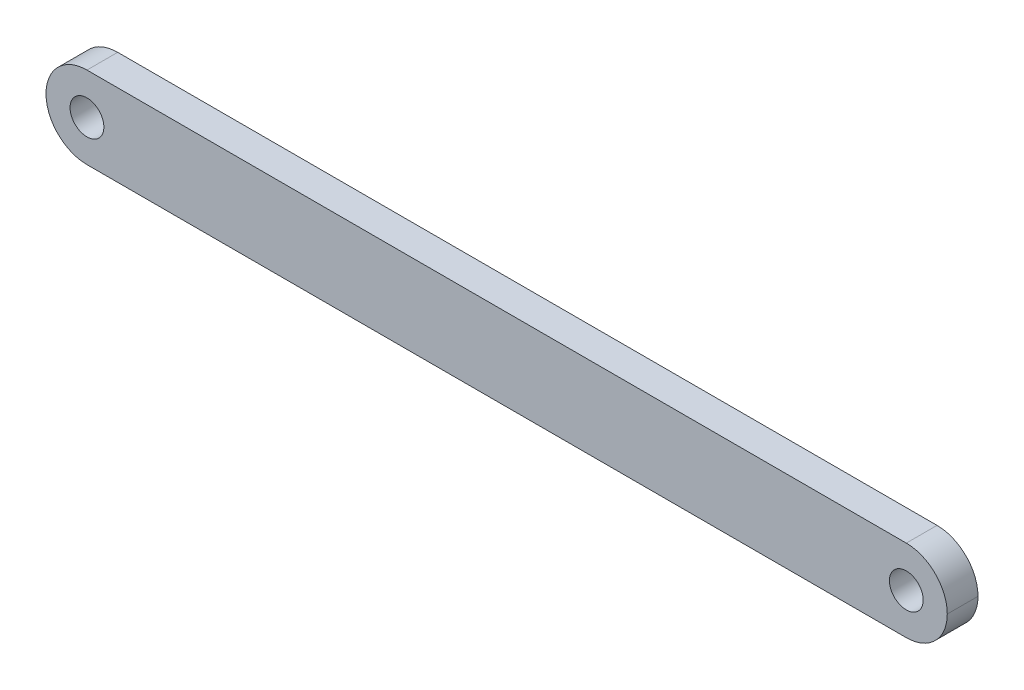
ISO-10303-21;
HEADER;
FILE_DESCRIPTION(('STEP AP214'),'2;1');
FILE_NAME('part.step','',(''),(''),'','','');
FILE_SCHEMA(('AUTOMOTIVE_DESIGN { 1 0 10303 214 1 1 1 1 }'));
ENDSEC;
DATA;
#1=APPLICATION_CONTEXT('core data for automotive mechanical design processes');
#2=APPLICATION_PROTOCOL_DEFINITION('international standard','automotive_design',2000,#1);
#3=PRODUCT_CONTEXT('',#1,'mechanical');
#4=PRODUCT('Part','Part','',(#3));
#5=PRODUCT_RELATED_PRODUCT_CATEGORY('part','',(#4));
#6=PRODUCT_DEFINITION_FORMATION('','',#4);
#7=PRODUCT_DEFINITION_CONTEXT('part definition',#1,'design');
#8=PRODUCT_DEFINITION('design','',#6,#7);
#9=PRODUCT_DEFINITION_SHAPE('','',#8);
#10=(LENGTH_UNIT() NAMED_UNIT(*) SI_UNIT(.MILLI.,.METRE.));
#11=(NAMED_UNIT(*) PLANE_ANGLE_UNIT() SI_UNIT($,.RADIAN.));
#12=(NAMED_UNIT(*) SI_UNIT($,.STERADIAN.) SOLID_ANGLE_UNIT());
#13=UNCERTAINTY_MEASURE_WITH_UNIT(LENGTH_MEASURE(1.E-05),#10,'distance_accuracy_value','');
#14=(GEOMETRIC_REPRESENTATION_CONTEXT(3) GLOBAL_UNCERTAINTY_ASSIGNED_CONTEXT((#13)) GLOBAL_UNIT_ASSIGNED_CONTEXT((#10,
#11,#12)) REPRESENTATION_CONTEXT('',''));
#15=CARTESIAN_POINT('',(0.,0.,0.));
#16=DIRECTION('',(0.,0.,1.));
#17=DIRECTION('',(1.,0.,0.));
#18=AXIS2_PLACEMENT_3D('',#15,#16,#17);
#19=CARTESIAN_POINT('',(55.8602220991314,3.999,0.));
#20=DIRECTION('',(0.,0.,-1.));
#21=DIRECTION('',(-1.,0.,0.));
#22=AXIS2_PLACEMENT_3D('',#19,#20,#21);
#23=PLANE('',#22);
#24=CARTESIAN_POINT('',(55.8597335084298,3.99951153429841,0.));
#25=DIRECTION('',(0.,0.,-1.));
#26=DIRECTION('',(1.,0.,0.));
#27=AXIS2_PLACEMENT_3D('',#24,#25,#26);
#28=CIRCLE('',#27,1.65);
#29=CARTESIAN_POINT('',(54.2097335084298,3.99951153429841,0.));
#30=VERTEX_POINT('',#29);
#31=EDGE_CURVE('E276',#30,#30,#28,.T.);
#32=ORIENTED_EDGE('',*,*,#31,.F.);
#33=EDGE_LOOP('',(#32));
#34=FACE_BOUND('',#33,.T.);
#35=CARTESIAN_POINT('',(-24.138809000818,3.99851153429842,0.));
#36=DIRECTION('',(0.,0.,-1.));
#37=DIRECTION('',(1.,0.,0.));
#38=AXIS2_PLACEMENT_3D('',#35,#36,#37);
#39=CIRCLE('',#38,1.65);
#40=CARTESIAN_POINT('',(-25.788809000818,3.99851153429842,0.));
#41=VERTEX_POINT('',#40);
#42=EDGE_CURVE('E280',#41,#41,#39,.T.);
#43=ORIENTED_EDGE('',*,*,#42,.F.);
#44=EDGE_LOOP('',(#43));
#45=FACE_BOUND('',#44,.T.);
#46=CARTESIAN_POINT('',(55.8602220991314,3.999,0.));
#47=DIRECTION('',(0.,0.,-1.));
#48=DIRECTION('',(-1.,0.,0.));
#49=AXIS2_PLACEMENT_3D('',#46,#47,#48);
#50=CIRCLE('',#49,4.);
#51=CARTESIAN_POINT('',(55.8602220991314,7.999,0.));
#52=VERTEX_POINT('',#51);
#53=CARTESIAN_POINT('',(59.8602219741314,3.99999999998902,0.));
#54=VERTEX_POINT('',#53);
#55=EDGE_CURVE('E138',#52,#54,#50,.T.);
#56=ORIENTED_EDGE('',*,*,#55,.T.);
#57=CARTESIAN_POINT('',(55.8602219741314,4.,0.));
#58=DIRECTION('',(0.,0.,-1.));
#59=DIRECTION('',(-1.,0.,0.));
#60=AXIS2_PLACEMENT_3D('',#57,#58,#59);
#61=CIRCLE('',#60,4.);
#62=CARTESIAN_POINT('',(55.8602219741314,0.,0.));
#63=VERTEX_POINT('',#62);
#64=EDGE_CURVE('E141',#54,#63,#61,.T.);
#65=ORIENTED_EDGE('',*,*,#64,.T.);
#66=DIRECTION('',(-1.,0.,0.));
#67=VECTOR('',#66,1.);
#68=CARTESIAN_POINT('',(55.8602219741314,0.,0.));
#69=LINE('',#68,#67);
#70=CARTESIAN_POINT('',(-24.1383206601164,0.,0.));
#71=VERTEX_POINT('',#70);
#72=EDGE_CURVE('E145',#63,#71,#69,.T.);
#73=ORIENTED_EDGE('',*,*,#72,.T.);
#74=CARTESIAN_POINT('',(-24.1383206601164,4.,0.));
#75=DIRECTION('',(0.,0.,-1.));
#76=DIRECTION('',(-1.,0.,0.));
#77=AXIS2_PLACEMENT_3D('',#74,#75,#76);
#78=CIRCLE('',#77,4.);
#79=CARTESIAN_POINT('',(-28.1383205351164,3.99900000000404,0.));
#80=VERTEX_POINT('',#79);
#81=EDGE_CURVE('E148',#71,#80,#78,.T.);
#82=ORIENTED_EDGE('',*,*,#81,.T.);
#83=CARTESIAN_POINT('',(-24.1383205351164,3.999,0.));
#84=DIRECTION('',(0.,0.,-1.));
#85=DIRECTION('',(-1.,0.,0.));
#86=AXIS2_PLACEMENT_3D('',#83,#84,#85);
#87=CIRCLE('',#86,4.);
#88=CARTESIAN_POINT('',(-24.1383205351164,7.999,0.));
#89=VERTEX_POINT('',#88);
#90=EDGE_CURVE('E115',#80,#89,#87,.T.);
#91=ORIENTED_EDGE('',*,*,#90,.T.);
#92=DIRECTION('',(1.,0.,0.));
#93=VECTOR('',#92,1.);
#94=CARTESIAN_POINT('',(-24.1383205351164,7.999,0.));
#95=LINE('',#94,#93);
#96=EDGE_CURVE('E151',#89,#52,#95,.T.);
#97=ORIENTED_EDGE('',*,*,#96,.T.);
#98=EDGE_LOOP('',(#56,#65,#73,#82,#91,#97));
#99=FACE_BOUND('',#98,.T.);
#100=DIRECTION('',(1.,0.,0.));
#101=VECTOR('',#100,1.);
#102=CARTESIAN_POINT('',(14.0528950600735,4.88743671366821,0.));
#103=LINE('',#102,#101);
#104=CARTESIAN_POINT('',(14.0528950600735,4.88743671366821,0.));
#105=VERTEX_POINT('',#104);
#106=CARTESIAN_POINT('',(15.6752908934068,4.88743671366821,0.));
#107=VERTEX_POINT('',#106);
#108=EDGE_CURVE('E231',#105,#107,#103,.T.);
#109=ORIENTED_EDGE('',*,*,#108,.T.);
#110=DIRECTION('',(0.,1.,0.));
#111=VECTOR('',#110,1.);
#112=CARTESIAN_POINT('',(15.6752908934068,4.88743671366821,0.));
#113=LINE('',#112,#111);
#114=CARTESIAN_POINT('',(15.6752908934068,5.24641107264257,0.));
#115=VERTEX_POINT('',#114);
#116=EDGE_CURVE('E56',#107,#115,#113,.T.);
#117=ORIENTED_EDGE('',*,*,#116,.T.);
#118=DIRECTION('',(-1.,0.,0.));
#119=VECTOR('',#118,1.);
#120=CARTESIAN_POINT('',(15.6752908934068,5.24641107264257,0.));
#121=LINE('',#120,#119);
#122=CARTESIAN_POINT('',(13.5214447395606,5.24641107264257,0.));
#123=VERTEX_POINT('',#122);
#124=EDGE_CURVE('E250',#115,#123,#121,.T.);
#125=ORIENTED_EDGE('',*,*,#124,.T.);
#126=DIRECTION('',(0.456090790910399,-0.889933250556876,0.));
#127=VECTOR('',#126,1.);
#128=CARTESIAN_POINT('',(13.5214447395606,5.24641107264257,0.));
#129=LINE('',#128,#127);
#130=CARTESIAN_POINT('',(15.3611883293042,1.65666748289898,0.));
#131=VERTEX_POINT('',#130);
#132=EDGE_CURVE('E253',#123,#131,#129,.T.);
#133=ORIENTED_EDGE('',*,*,#132,.T.);
#134=DIRECTION('',(0.87607248437468,0.482179429384514,0.));
#135=VECTOR('',#134,1.);
#136=CARTESIAN_POINT('',(15.3611883293042,1.65666748289898,0.));
#137=LINE('',#136,#135);
#138=CARTESIAN_POINT('',(15.6325224639196,1.80600642520667,0.));
#139=VERTEX_POINT('',#138);
#140=EDGE_CURVE('E256',#131,#139,#137,.T.);
#141=ORIENTED_EDGE('',*,*,#140,.T.);
#142=DIRECTION('',(-0.456180989989924,0.889887017756643,0.));
#143=VECTOR('',#142,1.);
#144=CARTESIAN_POINT('',(15.6325224639196,1.80600642520667,0.));
#145=LINE('',#144,#143);
#146=EDGE_CURVE('E236',#139,#105,#145,.T.);
#147=ORIENTED_EDGE('',*,*,#146,.T.);
#148=EDGE_LOOP('',(#109,#117,#125,#133,#141,#147));
#149=FACE_BOUND('',#148,.T.);
#150=ADVANCED_FACE('F39',(#34,#45,#99,#149),#23,.T.);
#151=CARTESIAN_POINT('',(55.8602220991314,3.999,3.));
#152=DIRECTION('',(0.,0.,-1.));
#153=DIRECTION('',(-1.,0.,0.));
#154=AXIS2_PLACEMENT_3D('',#151,#152,#153);
#155=CYLINDRICAL_SURFACE('',#154,4.);
#156=ORIENTED_EDGE('',*,*,#55,.F.);
#157=DIRECTION('',(0.,0.,-1.));
#158=VECTOR('',#157,1.);
#159=CARTESIAN_POINT('',(55.8602220991314,7.999,3.));
#160=LINE('',#159,#158);
#161=CARTESIAN_POINT('',(55.8602220991314,7.999,3.));
#162=VERTEX_POINT('',#161);
#163=EDGE_CURVE('E11',#162,#52,#160,.T.);
#164=ORIENTED_EDGE('',*,*,#163,.F.);
#165=CARTESIAN_POINT('',(55.8602220991314,3.999,3.));
#166=DIRECTION('',(0.,0.,-1.));
#167=DIRECTION('',(-1.,0.,0.));
#168=AXIS2_PLACEMENT_3D('',#165,#166,#167);
#169=CIRCLE('',#168,4.);
#170=CARTESIAN_POINT('',(59.8602219741314,3.99999999998902,3.));
#171=VERTEX_POINT('',#170);
#172=EDGE_CURVE('E153',#162,#171,#169,.T.);
#173=ORIENTED_EDGE('',*,*,#172,.T.);
#174=DIRECTION('',(0.,0.,-1.));
#175=VECTOR('',#174,1.);
#176=CARTESIAN_POINT('',(59.8602219741314,3.99999999998902,3.));
#177=LINE('',#176,#175);
#178=EDGE_CURVE('E43',#171,#54,#177,.T.);
#179=ORIENTED_EDGE('',*,*,#178,.T.);
#180=EDGE_LOOP('',(#156,#164,#173,#179));
#181=FACE_BOUND('',#180,.T.);
#182=ADVANCED_FACE('F41',(#181),#155,.T.);
#183=CARTESIAN_POINT('',(-24.1383205351164,7.999,3.));
#184=DIRECTION('',(0.,1.,0.));
#185=DIRECTION('',(0.,0.,1.));
#186=AXIS2_PLACEMENT_3D('',#183,#184,#185);
#187=PLANE('',#186);
#188=ORIENTED_EDGE('',*,*,#96,.F.);
#189=DIRECTION('',(0.,0.,-1.));
#190=VECTOR('',#189,1.);
#191=CARTESIAN_POINT('',(-24.1383205351164,7.999,3.));
#192=LINE('',#191,#190);
#193=CARTESIAN_POINT('',(-24.1383205351164,7.999,3.));
#194=VERTEX_POINT('',#193);
#195=EDGE_CURVE('E48',#194,#89,#192,.T.);
#196=ORIENTED_EDGE('',*,*,#195,.F.);
#197=DIRECTION('',(1.,0.,0.));
#198=VECTOR('',#197,1.);
#199=CARTESIAN_POINT('',(-24.1383205351164,7.999,3.));
#200=LINE('',#199,#198);
#201=EDGE_CURVE('E128',#194,#162,#200,.T.);
#202=ORIENTED_EDGE('',*,*,#201,.T.);
#203=ORIENTED_EDGE('',*,*,#163,.T.);
#204=EDGE_LOOP('',(#188,#196,#202,#203));
#205=FACE_BOUND('',#204,.T.);
#206=ADVANCED_FACE('F161',(#205),#187,.T.);
#207=CARTESIAN_POINT('',(-24.1383205351164,3.999,3.));
#208=DIRECTION('',(0.,0.,-1.));
#209=DIRECTION('',(-1.,0.,0.));
#210=AXIS2_PLACEMENT_3D('',#207,#208,#209);
#211=CYLINDRICAL_SURFACE('',#210,4.);
#212=ORIENTED_EDGE('',*,*,#90,.F.);
#213=DIRECTION('',(0.,0.,-1.));
#214=VECTOR('',#213,1.);
#215=CARTESIAN_POINT('',(-28.1383205351164,3.99900000000404,3.));
#216=LINE('',#215,#214);
#217=CARTESIAN_POINT('',(-28.1383205351164,3.99900000000404,3.));
#218=VERTEX_POINT('',#217);
#219=EDGE_CURVE('E109',#218,#80,#216,.T.);
#220=ORIENTED_EDGE('',*,*,#219,.F.);
#221=CARTESIAN_POINT('',(-24.1383205351164,3.999,3.));
#222=DIRECTION('',(0.,0.,-1.));
#223=DIRECTION('',(-1.,0.,0.));
#224=AXIS2_PLACEMENT_3D('',#221,#222,#223);
#225=CIRCLE('',#224,4.);
#226=EDGE_CURVE('E112',#218,#194,#225,.T.);
#227=ORIENTED_EDGE('',*,*,#226,.T.);
#228=ORIENTED_EDGE('',*,*,#195,.T.);
#229=EDGE_LOOP('',(#212,#220,#227,#228));
#230=FACE_BOUND('',#229,.T.);
#231=ADVANCED_FACE('F111',(#230),#211,.T.);
#232=CARTESIAN_POINT('',(-24.1383206601164,4.,3.));
#233=DIRECTION('',(0.,0.,-1.));
#234=DIRECTION('',(-1.,0.,0.));
#235=AXIS2_PLACEMENT_3D('',#232,#233,#234);
#236=CYLINDRICAL_SURFACE('',#235,4.);
#237=ORIENTED_EDGE('',*,*,#81,.F.);
#238=DIRECTION('',(0.,0.,-1.));
#239=VECTOR('',#238,1.);
#240=CARTESIAN_POINT('',(-24.1383206601164,0.,3.));
#241=LINE('',#240,#239);
#242=CARTESIAN_POINT('',(-24.1383206601164,0.,3.));
#243=VERTEX_POINT('',#242);
#244=EDGE_CURVE('E120',#243,#71,#241,.T.);
#245=ORIENTED_EDGE('',*,*,#244,.F.);
#246=CARTESIAN_POINT('',(-24.1383206601164,4.,3.));
#247=DIRECTION('',(0.,0.,-1.));
#248=DIRECTION('',(-1.,0.,0.));
#249=AXIS2_PLACEMENT_3D('',#246,#247,#248);
#250=CIRCLE('',#249,4.);
#251=EDGE_CURVE('E126',#243,#218,#250,.T.);
#252=ORIENTED_EDGE('',*,*,#251,.T.);
#253=ORIENTED_EDGE('',*,*,#219,.T.);
#254=EDGE_LOOP('',(#237,#245,#252,#253));
#255=FACE_BOUND('',#254,.T.);
#256=ADVANCED_FACE('F130',(#255),#236,.T.);
#257=CARTESIAN_POINT('',(55.8602219741314,0.,3.));
#258=DIRECTION('',(0.,-1.,0.));
#259=DIRECTION('',(0.,0.,-1.));
#260=AXIS2_PLACEMENT_3D('',#257,#258,#259);
#261=PLANE('',#260);
#262=ORIENTED_EDGE('',*,*,#72,.F.);
#263=DIRECTION('',(0.,0.,-1.));
#264=VECTOR('',#263,1.);
#265=CARTESIAN_POINT('',(55.8602219741314,0.,3.));
#266=LINE('',#265,#264);
#267=CARTESIAN_POINT('',(55.8602219741314,0.,3.));
#268=VERTEX_POINT('',#267);
#269=EDGE_CURVE('E156',#268,#63,#266,.T.);
#270=ORIENTED_EDGE('',*,*,#269,.F.);
#271=DIRECTION('',(-1.,0.,0.));
#272=VECTOR('',#271,1.);
#273=CARTESIAN_POINT('',(55.8602219741314,0.,3.));
#274=LINE('',#273,#272);
#275=EDGE_CURVE('E131',#268,#243,#274,.T.);
#276=ORIENTED_EDGE('',*,*,#275,.T.);
#277=ORIENTED_EDGE('',*,*,#244,.T.);
#278=EDGE_LOOP('',(#262,#270,#276,#277));
#279=FACE_BOUND('',#278,.T.);
#280=ADVANCED_FACE('F288',(#279),#261,.T.);
#281=CARTESIAN_POINT('',(55.8602219741314,4.,3.));
#282=DIRECTION('',(0.,0.,-1.));
#283=DIRECTION('',(-1.,0.,0.));
#284=AXIS2_PLACEMENT_3D('',#281,#282,#283);
#285=CYLINDRICAL_SURFACE('',#284,4.);
#286=ORIENTED_EDGE('',*,*,#64,.F.);
#287=ORIENTED_EDGE('',*,*,#178,.F.);
#288=CARTESIAN_POINT('',(55.8602219741314,4.,3.));
#289=DIRECTION('',(0.,0.,-1.));
#290=DIRECTION('',(-1.,0.,0.));
#291=AXIS2_PLACEMENT_3D('',#288,#289,#290);
#292=CIRCLE('',#291,4.);
#293=EDGE_CURVE('E133',#171,#268,#292,.T.);
#294=ORIENTED_EDGE('',*,*,#293,.T.);
#295=ORIENTED_EDGE('',*,*,#269,.T.);
#296=EDGE_LOOP('',(#286,#287,#294,#295));
#297=FACE_BOUND('',#296,.T.);
#298=ADVANCED_FACE('F158',(#297),#285,.T.);
#299=CARTESIAN_POINT('',(55.8602220991314,3.999,3.));
#300=DIRECTION('',(0.,0.,-1.));
#301=DIRECTION('',(-1.,0.,0.));
#302=AXIS2_PLACEMENT_3D('',#299,#300,#301);
#303=PLANE('',#302);
#304=CARTESIAN_POINT('',(55.8597335084298,3.99951153429841,3.));
#305=DIRECTION('',(0.,0.,-1.));
#306=DIRECTION('',(1.,0.,0.));
#307=AXIS2_PLACEMENT_3D('',#304,#305,#306);
#308=CIRCLE('',#307,1.65);
#309=CARTESIAN_POINT('',(54.2097335084298,3.99951153429841,3.));
#310=VERTEX_POINT('',#309);
#311=EDGE_CURVE('E277',#310,#310,#308,.T.);
#312=ORIENTED_EDGE('',*,*,#311,.T.);
#313=EDGE_LOOP('',(#312));
#314=FACE_BOUND('',#313,.T.);
#315=CARTESIAN_POINT('',(-24.138809000818,3.99851153429842,3.));
#316=DIRECTION('',(0.,0.,-1.));
#317=DIRECTION('',(1.,0.,0.));
#318=AXIS2_PLACEMENT_3D('',#315,#316,#317);
#319=CIRCLE('',#318,1.65);
#320=CARTESIAN_POINT('',(-25.788809000818,3.99851153429842,3.));
#321=VERTEX_POINT('',#320);
#322=EDGE_CURVE('E142',#321,#321,#319,.T.);
#323=ORIENTED_EDGE('',*,*,#322,.T.);
#324=EDGE_LOOP('',(#323));
#325=FACE_BOUND('',#324,.T.);
#326=ORIENTED_EDGE('',*,*,#172,.F.);
#327=ORIENTED_EDGE('',*,*,#201,.F.);
#328=ORIENTED_EDGE('',*,*,#226,.F.);
#329=ORIENTED_EDGE('',*,*,#251,.F.);
#330=ORIENTED_EDGE('',*,*,#275,.F.);
#331=ORIENTED_EDGE('',*,*,#293,.F.);
#332=EDGE_LOOP('',(#326,#327,#328,#329,#330,#331));
#333=FACE_BOUND('',#332,.T.);
#334=ADVANCED_FACE('F124',(#314,#325,#333),#303,.F.);
#335=CARTESIAN_POINT('',(-24.138809000818,3.99851153429842,3.));
#336=DIRECTION('',(0.,0.,-1.));
#337=DIRECTION('',(-1.,0.,0.));
#338=AXIS2_PLACEMENT_3D('',#335,#336,#337);
#339=CYLINDRICAL_SURFACE('',#338,1.65);
#340=CARTESIAN_POINT('',(-25.788809000818,3.99851153429842,3.));
#341=CARTESIAN_POINT('',(-25.788809000818,3.99851153429842,2.96875));
#342=CARTESIAN_POINT('',(-25.788809000818,3.99851153429842,2.9375));
#343=CARTESIAN_POINT('',(-25.788809000818,3.99851153429842,2.875));
#344=CARTESIAN_POINT('',(-25.788809000818,3.99851153429842,2.84375));
#345=CARTESIAN_POINT('',(-25.788809000818,3.99851153429842,2.78125));
#346=CARTESIAN_POINT('',(-25.788809000818,3.99851153429842,2.75));
#347=CARTESIAN_POINT('',(-25.788809000818,3.99851153429842,2.6875));
#348=CARTESIAN_POINT('',(-25.788809000818,3.99851153429842,2.65625));
#349=CARTESIAN_POINT('',(-25.788809000818,3.99851153429842,2.59375));
#350=CARTESIAN_POINT('',(-25.788809000818,3.99851153429842,2.5625));
#351=CARTESIAN_POINT('',(-25.788809000818,3.99851153429842,2.5));
#352=CARTESIAN_POINT('',(-25.788809000818,3.99851153429842,2.46875));
#353=CARTESIAN_POINT('',(-25.788809000818,3.99851153429842,2.40625));
#354=CARTESIAN_POINT('',(-25.788809000818,3.99851153429842,2.375));
#355=CARTESIAN_POINT('',(-25.788809000818,3.99851153429842,2.3125));
#356=CARTESIAN_POINT('',(-25.788809000818,3.99851153429842,2.28125));
#357=CARTESIAN_POINT('',(-25.788809000818,3.99851153429842,2.21875));
#358=CARTESIAN_POINT('',(-25.788809000818,3.99851153429842,2.1875));
#359=CARTESIAN_POINT('',(-25.788809000818,3.99851153429842,2.125));
#360=CARTESIAN_POINT('',(-25.788809000818,3.99851153429842,2.09375));
#361=CARTESIAN_POINT('',(-25.788809000818,3.99851153429842,2.03125));
#362=CARTESIAN_POINT('',(-25.788809000818,3.99851153429842,2.));
#363=CARTESIAN_POINT('',(-25.788809000818,3.99851153429842,1.9375));
#364=CARTESIAN_POINT('',(-25.788809000818,3.99851153429842,1.90625));
#365=CARTESIAN_POINT('',(-25.788809000818,3.99851153429842,1.84375));
#366=CARTESIAN_POINT('',(-25.788809000818,3.99851153429842,1.8125));
#367=CARTESIAN_POINT('',(-25.788809000818,3.99851153429842,1.75));
#368=CARTESIAN_POINT('',(-25.788809000818,3.99851153429842,1.71875));
#369=CARTESIAN_POINT('',(-25.788809000818,3.99851153429842,1.65625));
#370=CARTESIAN_POINT('',(-25.788809000818,3.99851153429842,1.625));
#371=CARTESIAN_POINT('',(-25.788809000818,3.99851153429842,1.5625));
#372=CARTESIAN_POINT('',(-25.788809000818,3.99851153429842,1.53125));
#373=CARTESIAN_POINT('',(-25.788809000818,3.99851153429842,1.46875));
#374=CARTESIAN_POINT('',(-25.788809000818,3.99851153429842,1.4375));
#375=CARTESIAN_POINT('',(-25.788809000818,3.99851153429842,1.375));
#376=CARTESIAN_POINT('',(-25.788809000818,3.99851153429842,1.34375));
#377=CARTESIAN_POINT('',(-25.788809000818,3.99851153429842,1.28125));
#378=CARTESIAN_POINT('',(-25.788809000818,3.99851153429842,1.25));
#379=CARTESIAN_POINT('',(-25.788809000818,3.99851153429842,1.1875));
#380=CARTESIAN_POINT('',(-25.788809000818,3.99851153429842,1.15625));
#381=CARTESIAN_POINT('',(-25.788809000818,3.99851153429842,1.09375));
#382=CARTESIAN_POINT('',(-25.788809000818,3.99851153429842,1.0625));
#383=CARTESIAN_POINT('',(-25.788809000818,3.99851153429842,1.));
#384=CARTESIAN_POINT('',(-25.788809000818,3.99851153429842,0.96875));
#385=CARTESIAN_POINT('',(-25.788809000818,3.99851153429842,0.90625));
#386=CARTESIAN_POINT('',(-25.788809000818,3.99851153429842,0.875));
#387=CARTESIAN_POINT('',(-25.788809000818,3.99851153429842,0.8125));
#388=CARTESIAN_POINT('',(-25.788809000818,3.99851153429842,0.78125));
#389=CARTESIAN_POINT('',(-25.788809000818,3.99851153429842,0.71875));
#390=CARTESIAN_POINT('',(-25.788809000818,3.99851153429842,0.6875));
#391=CARTESIAN_POINT('',(-25.788809000818,3.99851153429842,0.625));
#392=CARTESIAN_POINT('',(-25.788809000818,3.99851153429842,0.59375));
#393=CARTESIAN_POINT('',(-25.788809000818,3.99851153429842,0.53125));
#394=CARTESIAN_POINT('',(-25.788809000818,3.99851153429842,0.5));
#395=CARTESIAN_POINT('',(-25.788809000818,3.99851153429842,0.4375));
#396=CARTESIAN_POINT('',(-25.788809000818,3.99851153429842,0.40625));
#397=CARTESIAN_POINT('',(-25.788809000818,3.99851153429842,0.34375));
#398=CARTESIAN_POINT('',(-25.788809000818,3.99851153429842,0.3125));
#399=CARTESIAN_POINT('',(-25.788809000818,3.99851153429842,0.25));
#400=CARTESIAN_POINT('',(-25.788809000818,3.99851153429842,0.21875));
#401=CARTESIAN_POINT('',(-25.788809000818,3.99851153429842,0.15625));
#402=CARTESIAN_POINT('',(-25.788809000818,3.99851153429842,0.125));
#403=CARTESIAN_POINT('',(-25.788809000818,3.99851153429842,0.0625000000000001));
#404=CARTESIAN_POINT('',(-25.788809000818,3.99851153429842,0.03125));
#405=CARTESIAN_POINT('',(-25.788809000818,3.99851153429842,0.));
#406=B_SPLINE_CURVE_WITH_KNOTS('',3,(#340,#341,#342,#343,#344,#345,#346,#347,#348,#349,#350,
#351,#352,#353,#354,#355,#356,#357,#358,#359,#360,#361,#362,#363,#364,#365,#366,#367,#368,#369,
#370,#371,#372,#373,#374,#375,#376,#377,#378,#379,#380,#381,#382,#383,#384,#385,#386,#387,#388,
#389,#390,#391,#392,#393,#394,#395,#396,#397,#398,#399,#400,#401,#402,#403,#404,#405),
.UNSPECIFIED.,.F.,.F.,(4,2,2,2,2,2,2,2,2,2,2,2,2,2,2,2,2,2,2,2,2,2,2,2,2,2,2,2,2,2,2,2,4),(0.,
0.0937500000000001,0.1875,0.28125,0.375,0.46875,0.5625,0.656250000000001,0.750000000000001,
0.843750000000001,0.9375,1.03125,1.125,1.21875,1.3125,1.40625,1.5,1.59375,1.6875,1.78125,1.875,
1.96875,2.0625,2.15625,2.25,2.34375,2.4375,2.53125,2.625,2.71875,2.8125,2.90625,3.),.UNSPECIFIED.);
#407=EDGE_CURVE('BSEAM181',#321,#41,#406,.T.);
#408=ORIENTED_EDGE('',*,*,#322,.F.);
#409=ORIENTED_EDGE('',*,*,#42,.T.);
#410=ORIENTED_EDGE('',*,*,#407,.T.);
#411=ORIENTED_EDGE('',*,*,#407,.F.);
#412=EDGE_LOOP('',(#408,#410,#409,#411));
#413=FACE_BOUND('',#412,.T.);
#414=ADVANCED_FACE('F181',(#413),#339,.F.);
#415=CARTESIAN_POINT('',(55.8597335084298,3.99951153429841,3.));
#416=DIRECTION('',(0.,0.,-1.));
#417=DIRECTION('',(-1.,0.,0.));
#418=AXIS2_PLACEMENT_3D('',#415,#416,#417);
#419=CYLINDRICAL_SURFACE('',#418,1.65);
#420=CARTESIAN_POINT('',(54.2097335084298,3.99951153429841,3.));
#421=CARTESIAN_POINT('',(54.2097335084298,3.99951153429841,2.96875));
#422=CARTESIAN_POINT('',(54.2097335084298,3.99951153429841,2.9375));
#423=CARTESIAN_POINT('',(54.2097335084298,3.99951153429841,2.875));
#424=CARTESIAN_POINT('',(54.2097335084298,3.99951153429841,2.84375));
#425=CARTESIAN_POINT('',(54.2097335084298,3.99951153429841,2.78125));
#426=CARTESIAN_POINT('',(54.2097335084298,3.99951153429841,2.75));
#427=CARTESIAN_POINT('',(54.2097335084298,3.99951153429841,2.6875));
#428=CARTESIAN_POINT('',(54.2097335084298,3.99951153429841,2.65625));
#429=CARTESIAN_POINT('',(54.2097335084298,3.99951153429841,2.59375));
#430=CARTESIAN_POINT('',(54.2097335084298,3.99951153429841,2.5625));
#431=CARTESIAN_POINT('',(54.2097335084298,3.99951153429841,2.5));
#432=CARTESIAN_POINT('',(54.2097335084298,3.99951153429841,2.46875));
#433=CARTESIAN_POINT('',(54.2097335084298,3.99951153429841,2.40625));
#434=CARTESIAN_POINT('',(54.2097335084298,3.99951153429841,2.375));
#435=CARTESIAN_POINT('',(54.2097335084298,3.99951153429841,2.3125));
#436=CARTESIAN_POINT('',(54.2097335084298,3.99951153429841,2.28125));
#437=CARTESIAN_POINT('',(54.2097335084298,3.99951153429841,2.21875));
#438=CARTESIAN_POINT('',(54.2097335084298,3.99951153429841,2.1875));
#439=CARTESIAN_POINT('',(54.2097335084298,3.99951153429841,2.125));
#440=CARTESIAN_POINT('',(54.2097335084298,3.99951153429841,2.09375));
#441=CARTESIAN_POINT('',(54.2097335084298,3.99951153429841,2.03125));
#442=CARTESIAN_POINT('',(54.2097335084298,3.99951153429841,2.));
#443=CARTESIAN_POINT('',(54.2097335084298,3.99951153429841,1.9375));
#444=CARTESIAN_POINT('',(54.2097335084298,3.99951153429841,1.90625));
#445=CARTESIAN_POINT('',(54.2097335084298,3.99951153429841,1.84375));
#446=CARTESIAN_POINT('',(54.2097335084298,3.99951153429841,1.8125));
#447=CARTESIAN_POINT('',(54.2097335084298,3.99951153429841,1.75));
#448=CARTESIAN_POINT('',(54.2097335084298,3.99951153429841,1.71875));
#449=CARTESIAN_POINT('',(54.2097335084298,3.99951153429841,1.65625));
#450=CARTESIAN_POINT('',(54.2097335084298,3.99951153429841,1.625));
#451=CARTESIAN_POINT('',(54.2097335084298,3.99951153429841,1.5625));
#452=CARTESIAN_POINT('',(54.2097335084298,3.99951153429841,1.53125));
#453=CARTESIAN_POINT('',(54.2097335084298,3.99951153429841,1.46875));
#454=CARTESIAN_POINT('',(54.2097335084298,3.99951153429841,1.4375));
#455=CARTESIAN_POINT('',(54.2097335084298,3.99951153429841,1.375));
#456=CARTESIAN_POINT('',(54.2097335084298,3.99951153429841,1.34375));
#457=CARTESIAN_POINT('',(54.2097335084298,3.99951153429841,1.28125));
#458=CARTESIAN_POINT('',(54.2097335084298,3.99951153429841,1.25));
#459=CARTESIAN_POINT('',(54.2097335084298,3.99951153429841,1.1875));
#460=CARTESIAN_POINT('',(54.2097335084298,3.99951153429841,1.15625));
#461=CARTESIAN_POINT('',(54.2097335084298,3.99951153429841,1.09375));
#462=CARTESIAN_POINT('',(54.2097335084298,3.99951153429841,1.0625));
#463=CARTESIAN_POINT('',(54.2097335084298,3.99951153429841,1.));
#464=CARTESIAN_POINT('',(54.2097335084298,3.99951153429841,0.96875));
#465=CARTESIAN_POINT('',(54.2097335084298,3.99951153429841,0.90625));
#466=CARTESIAN_POINT('',(54.2097335084298,3.99951153429841,0.875));
#467=CARTESIAN_POINT('',(54.2097335084298,3.99951153429841,0.8125));
#468=CARTESIAN_POINT('',(54.2097335084298,3.99951153429841,0.78125));
#469=CARTESIAN_POINT('',(54.2097335084298,3.99951153429841,0.71875));
#470=CARTESIAN_POINT('',(54.2097335084298,3.99951153429841,0.6875));
#471=CARTESIAN_POINT('',(54.2097335084298,3.99951153429841,0.625));
#472=CARTESIAN_POINT('',(54.2097335084298,3.99951153429841,0.59375));
#473=CARTESIAN_POINT('',(54.2097335084298,3.99951153429841,0.53125));
#474=CARTESIAN_POINT('',(54.2097335084298,3.99951153429841,0.5));
#475=CARTESIAN_POINT('',(54.2097335084298,3.99951153429841,0.4375));
#476=CARTESIAN_POINT('',(54.2097335084298,3.99951153429841,0.40625));
#477=CARTESIAN_POINT('',(54.2097335084298,3.99951153429841,0.34375));
#478=CARTESIAN_POINT('',(54.2097335084298,3.99951153429841,0.3125));
#479=CARTESIAN_POINT('',(54.2097335084298,3.99951153429841,0.25));
#480=CARTESIAN_POINT('',(54.2097335084298,3.99951153429841,0.21875));
#481=CARTESIAN_POINT('',(54.2097335084298,3.99951153429841,0.15625));
#482=CARTESIAN_POINT('',(54.2097335084298,3.99951153429841,0.125));
#483=CARTESIAN_POINT('',(54.2097335084298,3.99951153429841,0.0625000000000001));
#484=CARTESIAN_POINT('',(54.2097335084298,3.99951153429841,0.03125));
#485=CARTESIAN_POINT('',(54.2097335084298,3.99951153429841,0.));
#486=B_SPLINE_CURVE_WITH_KNOTS('',3,(#420,#421,#422,#423,#424,#425,#426,#427,#428,#429,#430,
#431,#432,#433,#434,#435,#436,#437,#438,#439,#440,#441,#442,#443,#444,#445,#446,#447,#448,#449,
#450,#451,#452,#453,#454,#455,#456,#457,#458,#459,#460,#461,#462,#463,#464,#465,#466,#467,#468,
#469,#470,#471,#472,#473,#474,#475,#476,#477,#478,#479,#480,#481,#482,#483,#484,#485),
.UNSPECIFIED.,.F.,.F.,(4,2,2,2,2,2,2,2,2,2,2,2,2,2,2,2,2,2,2,2,2,2,2,2,2,2,2,2,2,2,2,2,4),(0.,
0.0937500000000001,0.1875,0.28125,0.375,0.46875,0.5625,0.656250000000001,0.750000000000001,
0.843750000000001,0.9375,1.03125,1.125,1.21875,1.3125,1.40625,1.5,1.59375,1.6875,1.78125,1.875,
1.96875,2.0625,2.15625,2.25,2.34375,2.4375,2.53125,2.625,2.71875,2.8125,2.90625,3.),.UNSPECIFIED.);
#487=EDGE_CURVE('BSEAM185',#310,#30,#486,.T.);
#488=ORIENTED_EDGE('',*,*,#311,.F.);
#489=ORIENTED_EDGE('',*,*,#31,.T.);
#490=ORIENTED_EDGE('',*,*,#487,.T.);
#491=ORIENTED_EDGE('',*,*,#487,.F.);
#492=EDGE_LOOP('',(#488,#490,#489,#491));
#493=FACE_BOUND('',#492,.T.);
#494=ADVANCED_FACE('F185',(#493),#419,.F.);
#495=CARTESIAN_POINT('',(15.6752908934068,4.88743671366821,1.));
#496=DIRECTION('',(-1.,0.,0.));
#497=DIRECTION('',(0.,0.,1.));
#498=AXIS2_PLACEMENT_3D('',#495,#496,#497);
#499=PLANE('',#498);
#500=ORIENTED_EDGE('',*,*,#116,.F.);
#501=DIRECTION('',(0.,0.,-1.));
#502=VECTOR('',#501,1.);
#503=CARTESIAN_POINT('',(15.6752908934068,4.88743671366821,1.));
#504=LINE('',#503,#502);
#505=CARTESIAN_POINT('',(15.6752908934068,4.88743671366821,1.));
#506=VERTEX_POINT('',#505);
#507=EDGE_CURVE('E248',#506,#107,#504,.T.);
#508=ORIENTED_EDGE('',*,*,#507,.F.);
#509=DIRECTION('',(0.,1.,0.));
#510=VECTOR('',#509,1.);
#511=CARTESIAN_POINT('',(15.6752908934068,4.88743671366821,1.));
#512=LINE('',#511,#510);
#513=CARTESIAN_POINT('',(15.6752908934068,5.24641107264257,1.));
#514=VERTEX_POINT('',#513);
#515=EDGE_CURVE('E220',#506,#514,#512,.T.);
#516=ORIENTED_EDGE('',*,*,#515,.T.);
#517=DIRECTION('',(0.,0.,-1.));
#518=VECTOR('',#517,1.);
#519=CARTESIAN_POINT('',(15.6752908934068,5.24641107264257,1.));
#520=LINE('',#519,#518);
#521=EDGE_CURVE('E274',#514,#115,#520,.T.);
#522=ORIENTED_EDGE('',*,*,#521,.T.);
#523=EDGE_LOOP('',(#500,#508,#516,#522));
#524=FACE_BOUND('',#523,.T.);
#525=ADVANCED_FACE('F188',(#524),#499,.T.);
#526=CARTESIAN_POINT('',(15.6752908934068,5.24641107264257,1.));
#527=DIRECTION('',(0.,-1.,0.));
#528=DIRECTION('',(0.,0.,-1.));
#529=AXIS2_PLACEMENT_3D('',#526,#527,#528);
#530=PLANE('',#529);
#531=ORIENTED_EDGE('',*,*,#124,.F.);
#532=ORIENTED_EDGE('',*,*,#521,.F.);
#533=DIRECTION('',(-1.,0.,0.));
#534=VECTOR('',#533,1.);
#535=CARTESIAN_POINT('',(15.6752908934068,5.24641107264257,1.));
#536=LINE('',#535,#534);
#537=CARTESIAN_POINT('',(13.5214447395606,5.24641107264257,1.));
#538=VERTEX_POINT('',#537);
#539=EDGE_CURVE('E228',#514,#538,#536,.T.);
#540=ORIENTED_EDGE('',*,*,#539,.T.);
#541=DIRECTION('',(0.,0.,-1.));
#542=VECTOR('',#541,1.);
#543=CARTESIAN_POINT('',(13.5214447395606,5.24641107264257,1.));
#544=LINE('',#543,#542);
#545=EDGE_CURVE('E271',#538,#123,#544,.T.);
#546=ORIENTED_EDGE('',*,*,#545,.T.);
#547=EDGE_LOOP('',(#531,#532,#540,#546));
#548=FACE_BOUND('',#547,.T.);
#549=ADVANCED_FACE('F191',(#548),#530,.T.);
#550=CARTESIAN_POINT('',(13.5214447395606,5.24641107264257,1.));
#551=DIRECTION('',(0.889933250556876,0.456090790910399,0.));
#552=DIRECTION('',(-0.456090790910399,0.889933250556876,0.));
#553=AXIS2_PLACEMENT_3D('',#550,#551,#552);
#554=PLANE('',#553);
#555=ORIENTED_EDGE('',*,*,#132,.F.);
#556=ORIENTED_EDGE('',*,*,#545,.F.);
#557=DIRECTION('',(0.456090790910399,-0.889933250556876,0.));
#558=VECTOR('',#557,1.);
#559=CARTESIAN_POINT('',(13.5214447395606,5.24641107264257,1.));
#560=LINE('',#559,#558);
#561=CARTESIAN_POINT('',(15.3611883293042,1.65666748289898,1.));
#562=VERTEX_POINT('',#561);
#563=EDGE_CURVE('E233',#538,#562,#560,.T.);
#564=ORIENTED_EDGE('',*,*,#563,.T.);
#565=DIRECTION('',(0.,0.,-1.));
#566=VECTOR('',#565,1.);
#567=CARTESIAN_POINT('',(15.3611883293042,1.65666748289898,1.));
#568=LINE('',#567,#566);
#569=EDGE_CURVE('E268',#562,#131,#568,.T.);
#570=ORIENTED_EDGE('',*,*,#569,.T.);
#571=EDGE_LOOP('',(#555,#556,#564,#570));
#572=FACE_BOUND('',#571,.T.);
#573=ADVANCED_FACE('F194',(#572),#554,.T.);
#574=CARTESIAN_POINT('',(15.3611883293042,1.65666748289898,1.));
#575=DIRECTION('',(-0.482179429384514,0.87607248437468,0.));
#576=DIRECTION('',(-0.87607248437468,-0.482179429384514,0.));
#577=AXIS2_PLACEMENT_3D('',#574,#575,#576);
#578=PLANE('',#577);
#579=ORIENTED_EDGE('',*,*,#140,.F.);
#580=ORIENTED_EDGE('',*,*,#569,.F.);
#581=DIRECTION('',(0.87607248437468,0.482179429384514,0.));
#582=VECTOR('',#581,1.);
#583=CARTESIAN_POINT('',(15.3611883293042,1.65666748289898,1.));
#584=LINE('',#583,#582);
#585=CARTESIAN_POINT('',(15.6325224639196,1.80600642520667,1.));
#586=VERTEX_POINT('',#585);
#587=EDGE_CURVE('E241',#562,#586,#584,.T.);
#588=ORIENTED_EDGE('',*,*,#587,.T.);
#589=DIRECTION('',(0.,0.,-1.));
#590=VECTOR('',#589,1.);
#591=CARTESIAN_POINT('',(15.6325224639196,1.80600642520667,1.));
#592=LINE('',#591,#590);
#593=EDGE_CURVE('E265',#586,#139,#592,.T.);
#594=ORIENTED_EDGE('',*,*,#593,.T.);
#595=EDGE_LOOP('',(#579,#580,#588,#594));
#596=FACE_BOUND('',#595,.T.);
#597=ADVANCED_FACE('F198',(#596),#578,.T.);
#598=CARTESIAN_POINT('',(15.6325224639196,1.80600642520667,1.));
#599=DIRECTION('',(-0.889887017756643,-0.456180989989924,0.));
#600=DIRECTION('',(0.456180989989924,-0.889887017756643,0.));
#601=AXIS2_PLACEMENT_3D('',#598,#599,#600);
#602=PLANE('',#601);
#603=ORIENTED_EDGE('',*,*,#146,.F.);
#604=ORIENTED_EDGE('',*,*,#593,.F.);
#605=DIRECTION('',(-0.456180989989924,0.889887017756643,0.));
#606=VECTOR('',#605,1.);
#607=CARTESIAN_POINT('',(15.6325224639196,1.80600642520667,1.));
#608=LINE('',#607,#606);
#609=CARTESIAN_POINT('',(14.0528950600735,4.88743671366821,1.));
#610=VERTEX_POINT('',#609);
#611=EDGE_CURVE('E244',#586,#610,#608,.T.);
#612=ORIENTED_EDGE('',*,*,#611,.T.);
#613=DIRECTION('',(0.,0.,-1.));
#614=VECTOR('',#613,1.);
#615=CARTESIAN_POINT('',(14.0528950600735,4.88743671366821,1.));
#616=LINE('',#615,#614);
#617=EDGE_CURVE('E262',#610,#105,#616,.T.);
#618=ORIENTED_EDGE('',*,*,#617,.T.);
#619=EDGE_LOOP('',(#603,#604,#612,#618));
#620=FACE_BOUND('',#619,.T.);
#621=ADVANCED_FACE('F202',(#620),#602,.T.);
#622=CARTESIAN_POINT('',(14.0528950600735,4.88743671366821,1.));
#623=DIRECTION('',(0.,1.,0.));
#624=DIRECTION('',(0.,0.,1.));
#625=AXIS2_PLACEMENT_3D('',#622,#623,#624);
#626=PLANE('',#625);
#627=ORIENTED_EDGE('',*,*,#108,.F.);
#628=ORIENTED_EDGE('',*,*,#617,.F.);
#629=DIRECTION('',(1.,0.,0.));
#630=VECTOR('',#629,1.);
#631=CARTESIAN_POINT('',(14.0528950600735,4.88743671366821,1.));
#632=LINE('',#631,#630);
#633=EDGE_CURVE('E224',#610,#506,#632,.T.);
#634=ORIENTED_EDGE('',*,*,#633,.T.);
#635=ORIENTED_EDGE('',*,*,#507,.T.);
#636=EDGE_LOOP('',(#627,#628,#634,#635));
#637=FACE_BOUND('',#636,.T.);
#638=ADVANCED_FACE('F206',(#637),#626,.T.);
#639=CARTESIAN_POINT('',(0.,0.,1.));
#640=DIRECTION('',(0.,0.,1.));
#641=DIRECTION('',(1.,0.,0.));
#642=AXIS2_PLACEMENT_3D('',#639,#640,#641);
#643=PLANE('',#642);
#644=ORIENTED_EDGE('',*,*,#515,.F.);
#645=ORIENTED_EDGE('',*,*,#633,.F.);
#646=ORIENTED_EDGE('',*,*,#611,.F.);
#647=ORIENTED_EDGE('',*,*,#587,.F.);
#648=ORIENTED_EDGE('',*,*,#563,.F.);
#649=ORIENTED_EDGE('',*,*,#539,.F.);
#650=EDGE_LOOP('',(#644,#645,#646,#647,#648,#649));
#651=FACE_BOUND('',#650,.T.);
#652=ADVANCED_FACE('F210',(#651),#643,.F.);
#653=CLOSED_SHELL('',(#150,#182,#206,#231,#256,#280,#298,#334,#414,#494,#525,#549,#573,#597,
#621,#638,#652));
#654=MANIFOLD_SOLID_BREP('B2',#653);
#655=ADVANCED_BREP_SHAPE_REPRESENTATION('',(#18,#654),#14);
#656=SHAPE_DEFINITION_REPRESENTATION(#9,#655);
ENDSEC;
END-ISO-10303-21;
